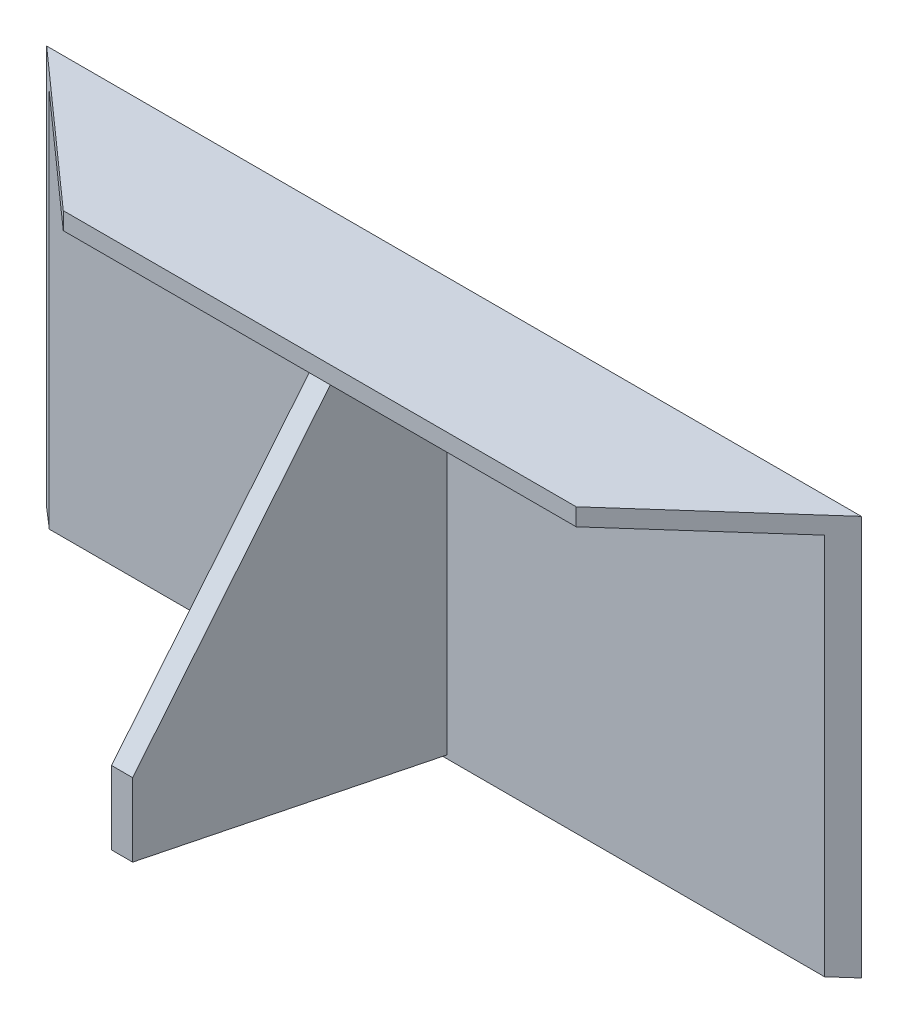
ISO-10303-21;
HEADER;
FILE_DESCRIPTION(('STEP AP214'),'2;1');
FILE_NAME('part.step','',(''),(''),'','','');
FILE_SCHEMA(('AUTOMOTIVE_DESIGN { 1 0 10303 214 1 1 1 1 }'));
ENDSEC;
DATA;
#1=APPLICATION_CONTEXT('core data for automotive mechanical design processes');
#2=APPLICATION_PROTOCOL_DEFINITION('international standard','automotive_design',2000,#1);
#3=PRODUCT_CONTEXT('',#1,'mechanical');
#4=PRODUCT('Part','Part','',(#3));
#5=PRODUCT_RELATED_PRODUCT_CATEGORY('part','',(#4));
#6=PRODUCT_DEFINITION_FORMATION('','',#4);
#7=PRODUCT_DEFINITION_CONTEXT('part definition',#1,'design');
#8=PRODUCT_DEFINITION('design','',#6,#7);
#9=PRODUCT_DEFINITION_SHAPE('','',#8);
#10=(LENGTH_UNIT() NAMED_UNIT(*) SI_UNIT(.MILLI.,.METRE.));
#11=(NAMED_UNIT(*) PLANE_ANGLE_UNIT() SI_UNIT($,.RADIAN.));
#12=(NAMED_UNIT(*) SI_UNIT($,.STERADIAN.) SOLID_ANGLE_UNIT());
#13=UNCERTAINTY_MEASURE_WITH_UNIT(LENGTH_MEASURE(1.E-05),#10,'distance_accuracy_value','');
#14=(GEOMETRIC_REPRESENTATION_CONTEXT(3) GLOBAL_UNCERTAINTY_ASSIGNED_CONTEXT((#13)) GLOBAL_UNIT_ASSIGNED_CONTEXT((#10,
#11,#12)) REPRESENTATION_CONTEXT('',''));
#15=CARTESIAN_POINT('',(0.,0.,0.));
#16=DIRECTION('',(0.,0.,1.));
#17=DIRECTION('',(1.,0.,0.));
#18=AXIS2_PLACEMENT_3D('',#15,#16,#17);
#19=CARTESIAN_POINT('',(0.,45.,220.));
#20=DIRECTION('',(0.,0.979714932282566,-0.200396236148707));
#21=DIRECTION('',(0.,0.200396236148707,0.979714932282566));
#22=AXIS2_PLACEMENT_3D('',#19,#20,#21);
#23=PLANE('',#22);
#24=DIRECTION('',(-1.,0.,0.));
#25=VECTOR('',#24,1.);
#26=CARTESIAN_POINT('',(0.,2.35227272727272,11.5));
#27=LINE('',#26,#25);
#28=CARTESIAN_POINT('',(277.,2.35227272727274,11.5));
#29=VERTEX_POINT('',#28);
#30=CARTESIAN_POINT('',(263.,2.35227272727273,11.5));
#31=VERTEX_POINT('',#30);
#32=EDGE_CURVE('E148',#29,#31,#27,.T.);
#33=ORIENTED_EDGE('',*,*,#32,.F.);
#34=DIRECTION('',(0.,0.200396236148707,0.979714932282565));
#35=VECTOR('',#34,1.);
#36=CARTESIAN_POINT('',(277.,45.,220.));
#37=LINE('',#36,#35);
#38=CARTESIAN_POINT('',(277.,45.,220.));
#39=VERTEX_POINT('',#38);
#40=EDGE_CURVE('E59',#29,#39,#37,.T.);
#41=ORIENTED_EDGE('',*,*,#40,.T.);
#42=DIRECTION('',(-1.,0.,0.));
#43=VECTOR('',#42,1.);
#44=CARTESIAN_POINT('',(263.,45.,220.));
#45=LINE('',#44,#43);
#46=CARTESIAN_POINT('',(263.,45.,220.));
#47=VERTEX_POINT('',#46);
#48=EDGE_CURVE('E44',#39,#47,#45,.T.);
#49=ORIENTED_EDGE('',*,*,#48,.T.);
#50=DIRECTION('',(0.,0.200396236148707,0.979714932282566));
#51=VECTOR('',#50,1.);
#52=CARTESIAN_POINT('',(263.,53.3730788299455,260.935052057511));
#53=LINE('',#52,#51);
#54=EDGE_CURVE('E154',#31,#47,#53,.T.);
#55=ORIENTED_EDGE('',*,*,#54,.F.);
#56=EDGE_LOOP('',(#33,#41,#49,#55));
#57=FACE_BOUND('',#56,.T.);
#58=ADVANCED_FACE('F36',(#57),#23,.F.);
#59=CARTESIAN_POINT('',(0.,265.,11.5));
#60=DIRECTION('',(0.,0.,-1.));
#61=DIRECTION('',(-1.,0.,0.));
#62=AXIS2_PLACEMENT_3D('',#59,#60,#61);
#63=PLANE('',#62);
#64=DIRECTION('',(0.,1.,0.));
#65=VECTOR('',#64,1.);
#66=CARTESIAN_POINT('',(277.,253.5,11.5));
#67=LINE('',#66,#65);
#68=CARTESIAN_POINT('',(277.,253.5,11.5));
#69=VERTEX_POINT('',#68);
#70=EDGE_CURVE('E170',#29,#69,#67,.T.);
#71=ORIENTED_EDGE('',*,*,#70,.F.);
#72=ORIENTED_EDGE('',*,*,#32,.T.);
#73=DIRECTION('',(0.,-1.,0.));
#74=VECTOR('',#73,1.);
#75=CARTESIAN_POINT('',(263.,253.5,11.5));
#76=LINE('',#75,#74);
#77=CARTESIAN_POINT('',(263.,253.5,11.5));
#78=VERTEX_POINT('',#77);
#79=EDGE_CURVE('E165',#78,#31,#76,.T.);
#80=ORIENTED_EDGE('',*,*,#79,.F.);
#81=DIRECTION('',(1.,0.,0.));
#82=VECTOR('',#81,1.);
#83=CARTESIAN_POINT('',(0.,253.5,11.5));
#84=LINE('',#83,#82);
#85=CARTESIAN_POINT('',(12.9213483146067,253.5,11.5));
#86=VERTEX_POINT('',#85);
#87=EDGE_CURVE('E207',#86,#78,#84,.T.);
#88=ORIENTED_EDGE('',*,*,#87,.F.);
#89=DIRECTION('',(0.,-1.,0.));
#90=VECTOR('',#89,1.);
#91=CARTESIAN_POINT('',(12.9213483146067,265.,11.5));
#92=LINE('',#91,#90);
#93=CARTESIAN_POINT('',(12.9213483146067,2.35227272727279,11.5));
#94=VERTEX_POINT('',#93);
#95=EDGE_CURVE('E143',#86,#94,#92,.T.);
#96=ORIENTED_EDGE('',*,*,#95,.T.);
#97=DIRECTION('',(0.,-1.,0.));
#98=VECTOR('',#97,1.);
#99=CARTESIAN_POINT('',(12.9213483146067,0.,11.5));
#100=LINE('',#99,#98);
#101=CARTESIAN_POINT('',(12.9213483146067,0.,11.5));
#102=VERTEX_POINT('',#101);
#103=EDGE_CURVE('E140',#94,#102,#100,.T.);
#104=ORIENTED_EDGE('',*,*,#103,.T.);
#105=DIRECTION('',(1.,0.,0.));
#106=VECTOR('',#105,1.);
#107=CARTESIAN_POINT('',(0.,0.,11.5));
#108=LINE('',#107,#106);
#109=CARTESIAN_POINT('',(527.078651685393,0.,11.5));
#110=VERTEX_POINT('',#109);
#111=EDGE_CURVE('E126',#102,#110,#108,.T.);
#112=ORIENTED_EDGE('',*,*,#111,.T.);
#113=DIRECTION('',(0.,1.,0.));
#114=VECTOR('',#113,1.);
#115=CARTESIAN_POINT('',(527.078651685393,265.,11.5));
#116=LINE('',#115,#114);
#117=CARTESIAN_POINT('',(527.078651685393,253.5,11.5));
#118=VERTEX_POINT('',#117);
#119=EDGE_CURVE('E185',#110,#118,#116,.T.);
#120=ORIENTED_EDGE('',*,*,#119,.T.);
#121=EDGE_CURVE('E194',#69,#118,#84,.T.);
#122=ORIENTED_EDGE('',*,*,#121,.F.);
#123=EDGE_LOOP('',(#71,#72,#80,#88,#96,#104,#112,#120,#122));
#124=FACE_BOUND('',#123,.T.);
#125=ADVANCED_FACE('F141',(#124),#63,.F.);
#126=CARTESIAN_POINT('',(0.,253.5,89.));
#127=DIRECTION('',(0.,1.,0.));
#128=DIRECTION('',(0.,0.,1.));
#129=AXIS2_PLACEMENT_3D('',#126,#127,#128);
#130=PLANE('',#129);
#131=DIRECTION('',(0.,0.,-1.));
#132=VECTOR('',#131,1.);
#133=CARTESIAN_POINT('',(263.,253.5,220.));
#134=LINE('',#133,#132);
#135=CARTESIAN_POINT('',(263.,253.5,89.));
#136=VERTEX_POINT('',#135);
#137=EDGE_CURVE('E172',#136,#78,#134,.T.);
#138=ORIENTED_EDGE('',*,*,#137,.F.);
#139=DIRECTION('',(1.,0.,0.));
#140=VECTOR('',#139,1.);
#141=CARTESIAN_POINT('',(0.,253.5,89.));
#142=LINE('',#141,#140);
#143=CARTESIAN_POINT('',(100.,253.5,89.));
#144=VERTEX_POINT('',#143);
#145=EDGE_CURVE('E195',#144,#136,#142,.T.);
#146=ORIENTED_EDGE('',*,*,#145,.F.);
#147=DIRECTION('',(-0.746997038573461,0.,-0.66482736433038));
#148=VECTOR('',#147,1.);
#149=CARTESIAN_POINT('',(44.199542436248,253.5,39.3375927682607));
#150=LINE('',#149,#148);
#151=EDGE_CURVE('E190',#144,#86,#150,.T.);
#152=ORIENTED_EDGE('',*,*,#151,.T.);
#153=ORIENTED_EDGE('',*,*,#87,.T.);
#154=EDGE_LOOP('',(#138,#146,#152,#153));
#155=FACE_BOUND('',#154,.T.);
#156=ADVANCED_FACE('F244',(#155),#130,.F.);
#157=DIRECTION('',(0.,0.,-1.));
#158=VECTOR('',#157,1.);
#159=CARTESIAN_POINT('',(277.,253.5,220.));
#160=LINE('',#159,#158);
#161=CARTESIAN_POINT('',(277.,253.5,89.));
#162=VERTEX_POINT('',#161);
#163=EDGE_CURVE('E177',#162,#69,#160,.T.);
#164=ORIENTED_EDGE('',*,*,#163,.T.);
#165=ORIENTED_EDGE('',*,*,#121,.T.);
#166=DIRECTION('',(-0.746997038573461,0.,0.66482736433038));
#167=VECTOR('',#166,1.);
#168=CARTESIAN_POINT('',(194.477986719491,253.5,307.514591819653));
#169=LINE('',#168,#167);
#170=CARTESIAN_POINT('',(440.,253.5,89.));
#171=VERTEX_POINT('',#170);
#172=EDGE_CURVE('E182',#118,#171,#169,.T.);
#173=ORIENTED_EDGE('',*,*,#172,.T.);
#174=EDGE_CURVE('E200',#162,#171,#142,.T.);
#175=ORIENTED_EDGE('',*,*,#174,.F.);
#176=EDGE_LOOP('',(#164,#165,#173,#175));
#177=FACE_BOUND('',#176,.T.);
#178=ADVANCED_FACE('F233',(#177),#130,.F.);
#179=CARTESIAN_POINT('',(0.,265.,0.));
#180=DIRECTION('',(0.,0.,-1.));
#181=DIRECTION('',(-1.,0.,0.));
#182=AXIS2_PLACEMENT_3D('',#179,#180,#181);
#183=PLANE('',#182);
#184=DIRECTION('',(-1.,0.,0.));
#185=VECTOR('',#184,1.);
#186=CARTESIAN_POINT('',(0.,265.,0.));
#187=LINE('',#186,#185);
#188=CARTESIAN_POINT('',(540.,265.,0.));
#189=VERTEX_POINT('',#188);
#190=CARTESIAN_POINT('',(0.,265.,0.));
#191=VERTEX_POINT('',#190);
#192=EDGE_CURVE('E136',#189,#191,#187,.T.);
#193=ORIENTED_EDGE('',*,*,#192,.F.);
#194=DIRECTION('',(0.,1.,0.));
#195=VECTOR('',#194,1.);
#196=CARTESIAN_POINT('',(540.,0.,0.));
#197=LINE('',#196,#195);
#198=CARTESIAN_POINT('',(540.,0.,0.));
#199=VERTEX_POINT('',#198);
#200=EDGE_CURVE('E255',#199,#189,#197,.T.);
#201=ORIENTED_EDGE('',*,*,#200,.F.);
#202=DIRECTION('',(1.,0.,0.));
#203=VECTOR('',#202,1.);
#204=CARTESIAN_POINT('',(0.,0.,0.));
#205=LINE('',#204,#203);
#206=CARTESIAN_POINT('',(12.9213483146067,0.,0.));
#207=VERTEX_POINT('',#206);
#208=EDGE_CURVE('E51',#207,#199,#205,.T.);
#209=ORIENTED_EDGE('',*,*,#208,.F.);
#210=CARTESIAN_POINT('',(0.,0.,0.));
#211=VERTEX_POINT('',#210);
#212=EDGE_CURVE('E257',#211,#207,#205,.T.);
#213=ORIENTED_EDGE('',*,*,#212,.F.);
#214=DIRECTION('',(0.,-1.,0.));
#215=VECTOR('',#214,1.);
#216=CARTESIAN_POINT('',(0.,0.,0.));
#217=LINE('',#216,#215);
#218=EDGE_CURVE('E202',#191,#211,#217,.T.);
#219=ORIENTED_EDGE('',*,*,#218,.F.);
#220=EDGE_LOOP('',(#193,#201,#209,#213,#219));
#221=FACE_BOUND('',#220,.T.);
#222=ADVANCED_FACE('F261',(#221),#183,.T.);
#223=CARTESIAN_POINT('',(0.,0.,11.5));
#224=DIRECTION('',(0.,1.,0.));
#225=DIRECTION('',(0.,0.,1.));
#226=AXIS2_PLACEMENT_3D('',#223,#224,#225);
#227=PLANE('',#226);
#228=DIRECTION('',(-0.746997038573461,0.,0.66482736433038));
#229=VECTOR('',#228,1.);
#230=CARTESIAN_POINT('',(232.966352324089,0.,273.259946431561));
#231=LINE('',#230,#229);
#232=EDGE_CURVE('E131',#199,#110,#231,.T.);
#233=ORIENTED_EDGE('',*,*,#232,.T.);
#234=ORIENTED_EDGE('',*,*,#111,.F.);
#235=DIRECTION('',(0.,0.,1.));
#236=VECTOR('',#235,1.);
#237=CARTESIAN_POINT('',(12.9213483146067,0.,0.));
#238=LINE('',#237,#236);
#239=EDGE_CURVE('E129',#207,#102,#238,.T.);
#240=ORIENTED_EDGE('',*,*,#239,.F.);
#241=ORIENTED_EDGE('',*,*,#208,.T.);
#242=EDGE_LOOP('',(#233,#234,#240,#241));
#243=FACE_BOUND('',#242,.T.);
#244=ADVANCED_FACE('F38',(#243),#227,.F.);
#245=CARTESIAN_POINT('',(0.,265.,11.5));
#246=DIRECTION('',(0.,-1.,0.));
#247=DIRECTION('',(0.,0.,-1.));
#248=AXIS2_PLACEMENT_3D('',#245,#246,#247);
#249=PLANE('',#248);
#250=DIRECTION('',(-1.,0.,0.));
#251=VECTOR('',#250,1.);
#252=CARTESIAN_POINT('',(0.,265.,89.));
#253=LINE('',#252,#251);
#254=CARTESIAN_POINT('',(440.,265.,89.));
#255=VERTEX_POINT('',#254);
#256=CARTESIAN_POINT('',(100.,265.,89.));
#257=VERTEX_POINT('',#256);
#258=EDGE_CURVE('E198',#255,#257,#253,.T.);
#259=ORIENTED_EDGE('',*,*,#258,.F.);
#260=DIRECTION('',(-0.746997038573461,0.,0.66482736433038));
#261=VECTOR('',#260,1.);
#262=CARTESIAN_POINT('',(540.,265.,0.));
#263=LINE('',#262,#261);
#264=EDGE_CURVE('E180',#189,#255,#263,.T.);
#265=ORIENTED_EDGE('',*,*,#264,.F.);
#266=ORIENTED_EDGE('',*,*,#192,.T.);
#267=DIRECTION('',(-0.746997038573461,0.,-0.66482736433038));
#268=VECTOR('',#267,1.);
#269=CARTESIAN_POINT('',(0.,265.,0.));
#270=LINE('',#269,#268);
#271=EDGE_CURVE('E188',#257,#191,#270,.T.);
#272=ORIENTED_EDGE('',*,*,#271,.F.);
#273=EDGE_LOOP('',(#259,#265,#266,#272));
#274=FACE_BOUND('',#273,.T.);
#275=ADVANCED_FACE('F263',(#274),#249,.F.);
#276=CARTESIAN_POINT('',(0.,253.5,89.));
#277=DIRECTION('',(0.,0.,1.));
#278=DIRECTION('',(1.,0.,0.));
#279=AXIS2_PLACEMENT_3D('',#276,#277,#278);
#280=PLANE('',#279);
#281=DIRECTION('',(0.,-1.,0.));
#282=VECTOR('',#281,1.);
#283=CARTESIAN_POINT('',(440.,253.5,89.));
#284=LINE('',#283,#282);
#285=EDGE_CURVE('E212',#255,#171,#284,.T.);
#286=ORIENTED_EDGE('',*,*,#285,.F.);
#287=ORIENTED_EDGE('',*,*,#258,.T.);
#288=DIRECTION('',(0.,1.,0.));
#289=VECTOR('',#288,1.);
#290=CARTESIAN_POINT('',(100.,253.5,89.));
#291=LINE('',#290,#289);
#292=EDGE_CURVE('E135',#144,#257,#291,.T.);
#293=ORIENTED_EDGE('',*,*,#292,.F.);
#294=ORIENTED_EDGE('',*,*,#145,.T.);
#295=EDGE_CURVE('E199',#136,#162,#142,.T.);
#296=ORIENTED_EDGE('',*,*,#295,.T.);
#297=ORIENTED_EDGE('',*,*,#174,.T.);
#298=EDGE_LOOP('',(#286,#287,#293,#294,#296,#297));
#299=FACE_BOUND('',#298,.T.);
#300=ADVANCED_FACE('F238',(#299),#280,.T.);
#301=CARTESIAN_POINT('',(0.,-2.50000000145967E-05,0.));
#302=DIRECTION('',(0.66482736433038,0.,-0.746997038573461));
#303=DIRECTION('',(-0.746997038573461,0.,-0.66482736433038));
#304=AXIS2_PLACEMENT_3D('',#301,#302,#303);
#305=PLANE('',#304);
#306=ORIENTED_EDGE('',*,*,#218,.T.);
#307=DIRECTION('',(0.740184431111828,0.134747211209222,0.658764143689527));
#308=VECTOR('',#307,1.);
#309=CARTESIAN_POINT('',(-2.49344469740945E-06,-4.53920282011262E-07,-2.21916578069441E-06));
#310=LINE('',#309,#308);
#311=EDGE_CURVE('E157',#211,#94,#310,.T.);
#312=ORIENTED_EDGE('',*,*,#311,.T.);
#313=ORIENTED_EDGE('',*,*,#95,.F.);
#314=ORIENTED_EDGE('',*,*,#151,.F.);
#315=ORIENTED_EDGE('',*,*,#292,.T.);
#316=ORIENTED_EDGE('',*,*,#271,.T.);
#317=EDGE_LOOP('',(#306,#312,#313,#314,#315,#316));
#318=FACE_BOUND('',#317,.T.);
#319=ADVANCED_FACE('F264',(#318),#305,.F.);
#320=CARTESIAN_POINT('',(540.,-2.50000000145967E-05,0.));
#321=DIRECTION('',(-0.66482736433038,0.,-0.746997038573461));
#322=DIRECTION('',(-0.746997038573461,0.,0.66482736433038));
#323=AXIS2_PLACEMENT_3D('',#320,#321,#322);
#324=PLANE('',#323);
#325=ORIENTED_EDGE('',*,*,#172,.F.);
#326=ORIENTED_EDGE('',*,*,#119,.F.);
#327=ORIENTED_EDGE('',*,*,#232,.F.);
#328=ORIENTED_EDGE('',*,*,#200,.T.);
#329=ORIENTED_EDGE('',*,*,#264,.T.);
#330=ORIENTED_EDGE('',*,*,#285,.T.);
#331=EDGE_LOOP('',(#325,#326,#327,#328,#329,#330));
#332=FACE_BOUND('',#331,.T.);
#333=ADVANCED_FACE('F246',(#332),#324,.F.);
#334=CARTESIAN_POINT('',(263.,253.5,220.));
#335=DIRECTION('',(1.,0.,0.));
#336=DIRECTION('',(0.,1.,0.));
#337=AXIS2_PLACEMENT_3D('',#334,#335,#336);
#338=PLANE('',#337);
#339=ORIENTED_EDGE('',*,*,#79,.T.);
#340=ORIENTED_EDGE('',*,*,#54,.T.);
#341=DIRECTION('',(0.,-1.,0.));
#342=VECTOR('',#341,1.);
#343=CARTESIAN_POINT('',(263.,253.5,220.));
#344=LINE('',#343,#342);
#345=CARTESIAN_POINT('',(263.,93.5,220.));
#346=VERTEX_POINT('',#345);
#347=EDGE_CURVE('E166',#346,#47,#344,.T.);
#348=ORIENTED_EDGE('',*,*,#347,.F.);
#349=DIRECTION('',(0.,0.773741794125483,-0.633501093940239));
#350=VECTOR('',#349,1.);
#351=CARTESIAN_POINT('',(263.,189.288218236243,141.573396319076));
#352=LINE('',#351,#350);
#353=EDGE_CURVE('E162',#346,#136,#352,.T.);
#354=ORIENTED_EDGE('',*,*,#353,.T.);
#355=ORIENTED_EDGE('',*,*,#137,.T.);
#356=EDGE_LOOP('',(#339,#340,#348,#354,#355));
#357=FACE_BOUND('',#356,.T.);
#358=ADVANCED_FACE('F219',(#357),#338,.F.);
#359=CARTESIAN_POINT('',(277.,253.5,220.));
#360=DIRECTION('',(-1.,0.,0.));
#361=DIRECTION('',(0.,0.,1.));
#362=AXIS2_PLACEMENT_3D('',#359,#360,#361);
#363=PLANE('',#362);
#364=DIRECTION('',(0.,1.,0.));
#365=VECTOR('',#364,1.);
#366=CARTESIAN_POINT('',(277.,253.5,220.));
#367=LINE('',#366,#365);
#368=CARTESIAN_POINT('',(277.,93.5,220.));
#369=VERTEX_POINT('',#368);
#370=EDGE_CURVE('E169',#39,#369,#367,.T.);
#371=ORIENTED_EDGE('',*,*,#370,.F.);
#372=ORIENTED_EDGE('',*,*,#40,.F.);
#373=ORIENTED_EDGE('',*,*,#70,.T.);
#374=ORIENTED_EDGE('',*,*,#163,.F.);
#375=DIRECTION('',(0.,0.773741794125482,-0.633501093940239));
#376=VECTOR('',#375,1.);
#377=CARTESIAN_POINT('',(277.,253.5,89.));
#378=LINE('',#377,#376);
#379=EDGE_CURVE('E160',#369,#162,#378,.T.);
#380=ORIENTED_EDGE('',*,*,#379,.F.);
#381=EDGE_LOOP('',(#371,#372,#373,#374,#380));
#382=FACE_BOUND('',#381,.T.);
#383=ADVANCED_FACE('F228',(#382),#363,.F.);
#384=CARTESIAN_POINT('',(263.,0.,220.));
#385=DIRECTION('',(0.,0.,1.));
#386=DIRECTION('',(1.,0.,0.));
#387=AXIS2_PLACEMENT_3D('',#384,#385,#386);
#388=PLANE('',#387);
#389=ORIENTED_EDGE('',*,*,#48,.F.);
#390=ORIENTED_EDGE('',*,*,#370,.T.);
#391=DIRECTION('',(1.,0.,0.));
#392=VECTOR('',#391,1.);
#393=CARTESIAN_POINT('',(263.,93.5,220.));
#394=LINE('',#393,#392);
#395=EDGE_CURVE('E213',#346,#369,#394,.T.);
#396=ORIENTED_EDGE('',*,*,#395,.F.);
#397=ORIENTED_EDGE('',*,*,#347,.T.);
#398=EDGE_LOOP('',(#389,#390,#396,#397));
#399=FACE_BOUND('',#398,.T.);
#400=ADVANCED_FACE('F222',(#399),#388,.T.);
#401=CARTESIAN_POINT('',(0.,253.5,89.));
#402=DIRECTION('',(0.,-0.633501093940239,-0.773741794125482));
#403=DIRECTION('',(0.,0.773741794125483,-0.633501093940239));
#404=AXIS2_PLACEMENT_3D('',#401,#402,#403);
#405=PLANE('',#404);
#406=ORIENTED_EDGE('',*,*,#395,.T.);
#407=ORIENTED_EDGE('',*,*,#379,.T.);
#408=ORIENTED_EDGE('',*,*,#295,.F.);
#409=ORIENTED_EDGE('',*,*,#353,.F.);
#410=EDGE_LOOP('',(#406,#407,#408,#409));
#411=FACE_BOUND('',#410,.T.);
#412=ADVANCED_FACE('F225',(#411),#405,.F.);
#413=ORIENTED_EDGE('',*,*,#212,.T.);
#414=DIRECTION('',(0.,0.200396236148707,0.979714932282566));
#415=VECTOR('',#414,1.);
#416=CARTESIAN_POINT('',(12.9213483146067,45.,220.));
#417=LINE('',#416,#415);
#418=EDGE_CURVE('E11',#207,#94,#417,.T.);
#419=ORIENTED_EDGE('',*,*,#418,.T.);
#420=ORIENTED_EDGE('',*,*,#311,.F.);
#421=EDGE_LOOP('',(#413,#419,#420));
#422=FACE_BOUND('',#421,.T.);
#423=ADVANCED_FACE('F275',(#422),#23,.F.);
#424=CARTESIAN_POINT('',(12.9213483146067,0.,0.));
#425=DIRECTION('',(-1.,0.,0.));
#426=DIRECTION('',(0.,0.,1.));
#427=AXIS2_PLACEMENT_3D('',#424,#425,#426);
#428=PLANE('',#427);
#429=ORIENTED_EDGE('',*,*,#418,.F.);
#430=ORIENTED_EDGE('',*,*,#239,.T.);
#431=ORIENTED_EDGE('',*,*,#103,.F.);
#432=EDGE_LOOP('',(#429,#430,#431));
#433=FACE_BOUND('',#432,.T.);
#434=ADVANCED_FACE('F147',(#433),#428,.T.);
#435=CLOSED_SHELL('',(#58,#125,#156,#178,#222,#244,#275,#300,#319,#333,#358,#383,#400,#412,#423,#434));
#436=MANIFOLD_SOLID_BREP('B2',#435);
#437=ADVANCED_BREP_SHAPE_REPRESENTATION('',(#18,#436),#14);
#438=SHAPE_DEFINITION_REPRESENTATION(#9,#437);
ENDSEC;
END-ISO-10303-21;
